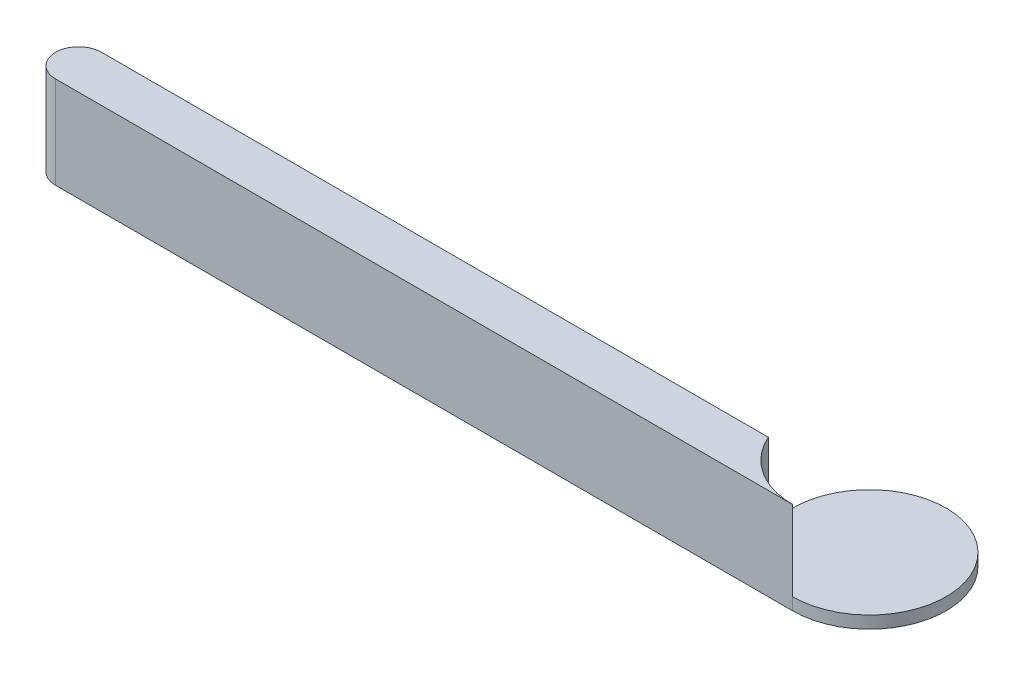
ISO-10303-21;
HEADER;
FILE_DESCRIPTION(('STEP AP214'),'2;1');
FILE_NAME('part.step','',(''),(''),'','','');
FILE_SCHEMA(('AUTOMOTIVE_DESIGN { 1 0 10303 214 1 1 1 1 }'));
ENDSEC;
DATA;
#1=APPLICATION_CONTEXT('core data for automotive mechanical design processes');
#2=APPLICATION_PROTOCOL_DEFINITION('international standard','automotive_design',2000,#1);
#3=PRODUCT_CONTEXT('',#1,'mechanical');
#4=PRODUCT('Part','Part','',(#3));
#5=PRODUCT_RELATED_PRODUCT_CATEGORY('part','',(#4));
#6=PRODUCT_DEFINITION_FORMATION('','',#4);
#7=PRODUCT_DEFINITION_CONTEXT('part definition',#1,'design');
#8=PRODUCT_DEFINITION('design','',#6,#7);
#9=PRODUCT_DEFINITION_SHAPE('','',#8);
#10=(LENGTH_UNIT() NAMED_UNIT(*) SI_UNIT(.MILLI.,.METRE.));
#11=(NAMED_UNIT(*) PLANE_ANGLE_UNIT() SI_UNIT($,.RADIAN.));
#12=(NAMED_UNIT(*) SI_UNIT($,.STERADIAN.) SOLID_ANGLE_UNIT());
#13=UNCERTAINTY_MEASURE_WITH_UNIT(LENGTH_MEASURE(1.E-05),#10,'distance_accuracy_value','');
#14=(GEOMETRIC_REPRESENTATION_CONTEXT(3) GLOBAL_UNCERTAINTY_ASSIGNED_CONTEXT((#13)) GLOBAL_UNIT_ASSIGNED_CONTEXT((#10,
#11,#12)) REPRESENTATION_CONTEXT('',''));
#15=CARTESIAN_POINT('',(0.,0.,0.));
#16=DIRECTION('',(0.,0.,1.));
#17=DIRECTION('',(1.,0.,0.));
#18=AXIS2_PLACEMENT_3D('',#15,#16,#17);
#19=CARTESIAN_POINT('',(152.4,19.05,-11.1125));
#20=DIRECTION('',(0.,-1.,0.));
#21=DIRECTION('',(0.,0.,-1.));
#22=AXIS2_PLACEMENT_3D('',#19,#20,#21);
#23=CYLINDRICAL_SURFACE('',#22,15.875);
#24=CARTESIAN_POINT('',(152.4,2.54,-11.1125));
#25=DIRECTION('',(0.,1.,0.));
#26=DIRECTION('',(0.,0.,1.));
#27=AXIS2_PLACEMENT_3D('',#24,#25,#26);
#28=CIRCLE('',#27,15.875);
#29=CARTESIAN_POINT('',(152.4,2.54,4.76250000000002));
#30=VERTEX_POINT('',#29);
#31=CARTESIAN_POINT('',(137.850322168515,2.54,-4.7625));
#32=VERTEX_POINT('',#31);
#33=EDGE_CURVE('E101',#30,#32,#28,.T.);
#34=ORIENTED_EDGE('',*,*,#33,.F.);
#35=DIRECTION('',(0.,-1.,0.));
#36=VECTOR('',#35,1.);
#37=CARTESIAN_POINT('',(152.4,19.05,4.7625));
#38=LINE('',#37,#36);
#39=CARTESIAN_POINT('',(152.4,0.,4.7625));
#40=VERTEX_POINT('',#39);
#41=EDGE_CURVE('E96',#30,#40,#38,.T.);
#42=ORIENTED_EDGE('',*,*,#41,.T.);
#43=CARTESIAN_POINT('',(152.4,0.,-11.1125));
#44=DIRECTION('',(0.,1.,0.));
#45=DIRECTION('',(0.,0.,1.));
#46=AXIS2_PLACEMENT_3D('',#43,#44,#45);
#47=CIRCLE('',#46,15.875);
#48=CARTESIAN_POINT('',(137.850322168515,0.,-4.7625));
#49=VERTEX_POINT('',#48);
#50=EDGE_CURVE('E120',#40,#49,#47,.T.);
#51=ORIENTED_EDGE('',*,*,#50,.T.);
#52=DIRECTION('',(0.,-1.,0.));
#53=VECTOR('',#52,1.);
#54=CARTESIAN_POINT('',(137.850322168515,19.05,-4.7625));
#55=LINE('',#54,#53);
#56=EDGE_CURVE('E71',#32,#49,#55,.T.);
#57=ORIENTED_EDGE('',*,*,#56,.F.);
#58=EDGE_LOOP('',(#34,#42,#51,#57));
#59=FACE_BOUND('',#58,.T.);
#60=ADVANCED_FACE('F35',(#59),#23,.T.);
#61=CARTESIAN_POINT('',(0.,19.05,0.));
#62=DIRECTION('',(0.,-1.,0.));
#63=DIRECTION('',(0.,0.,-1.));
#64=AXIS2_PLACEMENT_3D('',#61,#62,#63);
#65=CYLINDRICAL_SURFACE('',#64,4.7625);
#66=CARTESIAN_POINT('',(0.,0.,0.));
#67=DIRECTION('',(0.,1.,0.));
#68=DIRECTION('',(0.,0.,1.));
#69=AXIS2_PLACEMENT_3D('',#66,#67,#68);
#70=CIRCLE('',#69,4.7625);
#71=CARTESIAN_POINT('',(0.,0.,-4.7625));
#72=VERTEX_POINT('',#71);
#73=CARTESIAN_POINT('',(0.,0.,4.7625));
#74=VERTEX_POINT('',#73);
#75=EDGE_CURVE('E105',#72,#74,#70,.T.);
#76=ORIENTED_EDGE('',*,*,#75,.T.);
#77=DIRECTION('',(0.,-1.,0.));
#78=VECTOR('',#77,1.);
#79=CARTESIAN_POINT('',(0.,19.05,4.7625));
#80=LINE('',#79,#78);
#81=CARTESIAN_POINT('',(0.,19.05,4.7625));
#82=VERTEX_POINT('',#81);
#83=EDGE_CURVE('E44',#82,#74,#80,.T.);
#84=ORIENTED_EDGE('',*,*,#83,.F.);
#85=CARTESIAN_POINT('',(0.,19.05,0.));
#86=DIRECTION('',(0.,1.,0.));
#87=DIRECTION('',(0.,0.,1.));
#88=AXIS2_PLACEMENT_3D('',#85,#86,#87);
#89=CIRCLE('',#88,4.7625);
#90=CARTESIAN_POINT('',(0.,19.05,-4.7625));
#91=VERTEX_POINT('',#90);
#92=EDGE_CURVE('E126',#91,#82,#89,.T.);
#93=ORIENTED_EDGE('',*,*,#92,.F.);
#94=DIRECTION('',(0.,-1.,0.));
#95=VECTOR('',#94,1.);
#96=CARTESIAN_POINT('',(0.,19.05,-4.7625));
#97=LINE('',#96,#95);
#98=EDGE_CURVE('E117',#91,#72,#97,.T.);
#99=ORIENTED_EDGE('',*,*,#98,.T.);
#100=EDGE_LOOP('',(#76,#84,#93,#99));
#101=FACE_BOUND('',#100,.T.);
#102=ADVANCED_FACE('F37',(#101),#65,.T.);
#103=CARTESIAN_POINT('',(0.,19.05,4.7625));
#104=DIRECTION('',(0.,0.,-1.));
#105=DIRECTION('',(-1.,0.,0.));
#106=AXIS2_PLACEMENT_3D('',#103,#104,#105);
#107=PLANE('',#106);
#108=DIRECTION('',(1.,0.,0.));
#109=VECTOR('',#108,1.);
#110=CARTESIAN_POINT('',(0.,0.,4.7625));
#111=LINE('',#110,#109);
#112=EDGE_CURVE('E107',#74,#40,#111,.T.);
#113=ORIENTED_EDGE('',*,*,#112,.T.);
#114=ORIENTED_EDGE('',*,*,#41,.F.);
#115=CARTESIAN_POINT('',(152.4,19.05,4.76250000000002));
#116=VERTEX_POINT('',#115);
#117=EDGE_CURVE('E90',#116,#30,#38,.T.);
#118=ORIENTED_EDGE('',*,*,#117,.F.);
#119=DIRECTION('',(1.,0.,0.));
#120=VECTOR('',#119,1.);
#121=CARTESIAN_POINT('',(0.,19.05,4.7625));
#122=LINE('',#121,#120);
#123=EDGE_CURVE('E81',#82,#116,#122,.T.);
#124=ORIENTED_EDGE('',*,*,#123,.F.);
#125=ORIENTED_EDGE('',*,*,#83,.T.);
#126=EDGE_LOOP('',(#113,#114,#118,#124,#125));
#127=FACE_BOUND('',#126,.T.);
#128=ADVANCED_FACE('F106',(#127),#107,.F.);
#129=CARTESIAN_POINT('',(0.,19.05,-4.7625));
#130=DIRECTION('',(0.,0.,1.));
#131=DIRECTION('',(1.,0.,0.));
#132=AXIS2_PLACEMENT_3D('',#129,#130,#131);
#133=PLANE('',#132);
#134=DIRECTION('',(-1.,0.,0.));
#135=VECTOR('',#134,1.);
#136=CARTESIAN_POINT('',(0.,0.,-4.7625));
#137=LINE('',#136,#135);
#138=EDGE_CURVE('E74',#49,#72,#137,.T.);
#139=ORIENTED_EDGE('',*,*,#138,.T.);
#140=ORIENTED_EDGE('',*,*,#98,.F.);
#141=DIRECTION('',(-1.,0.,0.));
#142=VECTOR('',#141,1.);
#143=CARTESIAN_POINT('',(0.,19.05,-4.7625));
#144=LINE('',#143,#142);
#145=CARTESIAN_POINT('',(137.850322168515,19.05,-4.7625));
#146=VERTEX_POINT('',#145);
#147=EDGE_CURVE('E52',#146,#91,#144,.T.);
#148=ORIENTED_EDGE('',*,*,#147,.F.);
#149=EDGE_CURVE('E109',#146,#32,#55,.T.);
#150=ORIENTED_EDGE('',*,*,#149,.T.);
#151=ORIENTED_EDGE('',*,*,#56,.T.);
#152=EDGE_LOOP('',(#139,#140,#148,#150,#151));
#153=FACE_BOUND('',#152,.T.);
#154=ADVANCED_FACE('F131',(#153),#133,.F.);
#155=CARTESIAN_POINT('',(0.,19.05,0.));
#156=DIRECTION('',(0.,1.,0.));
#157=DIRECTION('',(0.,0.,1.));
#158=AXIS2_PLACEMENT_3D('',#155,#156,#157);
#159=PLANE('',#158);
#160=CARTESIAN_POINT('',(152.4,19.05,-11.1125));
#161=DIRECTION('',(0.,1.,0.));
#162=DIRECTION('',(0.,0.,1.));
#163=AXIS2_PLACEMENT_3D('',#160,#161,#162);
#164=CIRCLE('',#163,15.875);
#165=EDGE_CURVE('E11',#146,#116,#164,.T.);
#166=ORIENTED_EDGE('',*,*,#165,.F.);
#167=ORIENTED_EDGE('',*,*,#147,.T.);
#168=ORIENTED_EDGE('',*,*,#92,.T.);
#169=ORIENTED_EDGE('',*,*,#123,.T.);
#170=EDGE_LOOP('',(#166,#167,#168,#169));
#171=FACE_BOUND('',#170,.T.);
#172=ADVANCED_FACE('F128',(#171),#159,.T.);
#173=CARTESIAN_POINT('',(0.,0.,0.));
#174=DIRECTION('',(0.,1.,0.));
#175=DIRECTION('',(0.,0.,1.));
#176=AXIS2_PLACEMENT_3D('',#173,#174,#175);
#177=PLANE('',#176);
#178=ORIENTED_EDGE('',*,*,#75,.F.);
#179=ORIENTED_EDGE('',*,*,#138,.F.);
#180=ORIENTED_EDGE('',*,*,#50,.F.);
#181=ORIENTED_EDGE('',*,*,#112,.F.);
#182=EDGE_LOOP('',(#178,#179,#180,#181));
#183=FACE_BOUND('',#182,.T.);
#184=ADVANCED_FACE('F130',(#183),#177,.F.);
#185=CARTESIAN_POINT('',(152.4,2.54,-11.1125));
#186=DIRECTION('',(0.,1.,0.));
#187=DIRECTION('',(0.,0.,1.));
#188=AXIS2_PLACEMENT_3D('',#185,#186,#187);
#189=CYLINDRICAL_SURFACE('',#188,15.875);
#190=EDGE_CURVE('E93',#32,#30,#28,.T.);
#191=ORIENTED_EDGE('',*,*,#190,.F.);
#192=ORIENTED_EDGE('',*,*,#149,.F.);
#193=ORIENTED_EDGE('',*,*,#165,.T.);
#194=ORIENTED_EDGE('',*,*,#117,.T.);
#195=EDGE_LOOP('',(#191,#192,#193,#194));
#196=FACE_BOUND('',#195,.T.);
#197=ADVANCED_FACE('F92',(#196),#189,.F.);
#198=CARTESIAN_POINT('',(152.4,2.54,-11.1125));
#199=DIRECTION('',(0.,1.,0.));
#200=DIRECTION('',(0.,0.,1.));
#201=AXIS2_PLACEMENT_3D('',#198,#199,#200);
#202=PLANE('',#201);
#203=ORIENTED_EDGE('',*,*,#33,.T.);
#204=ORIENTED_EDGE('',*,*,#190,.T.);
#205=EDGE_LOOP('',(#203,#204));
#206=FACE_BOUND('',#205,.T.);
#207=ADVANCED_FACE('F100',(#206),#202,.T.);
#208=CLOSED_SHELL('',(#60,#102,#128,#154,#172,#184,#197,#207));
#209=MANIFOLD_SOLID_BREP('B2',#208);
#210=ADVANCED_BREP_SHAPE_REPRESENTATION('',(#18,#209),#14);
#211=SHAPE_DEFINITION_REPRESENTATION(#9,#210);
ENDSEC;
END-ISO-10303-21;
